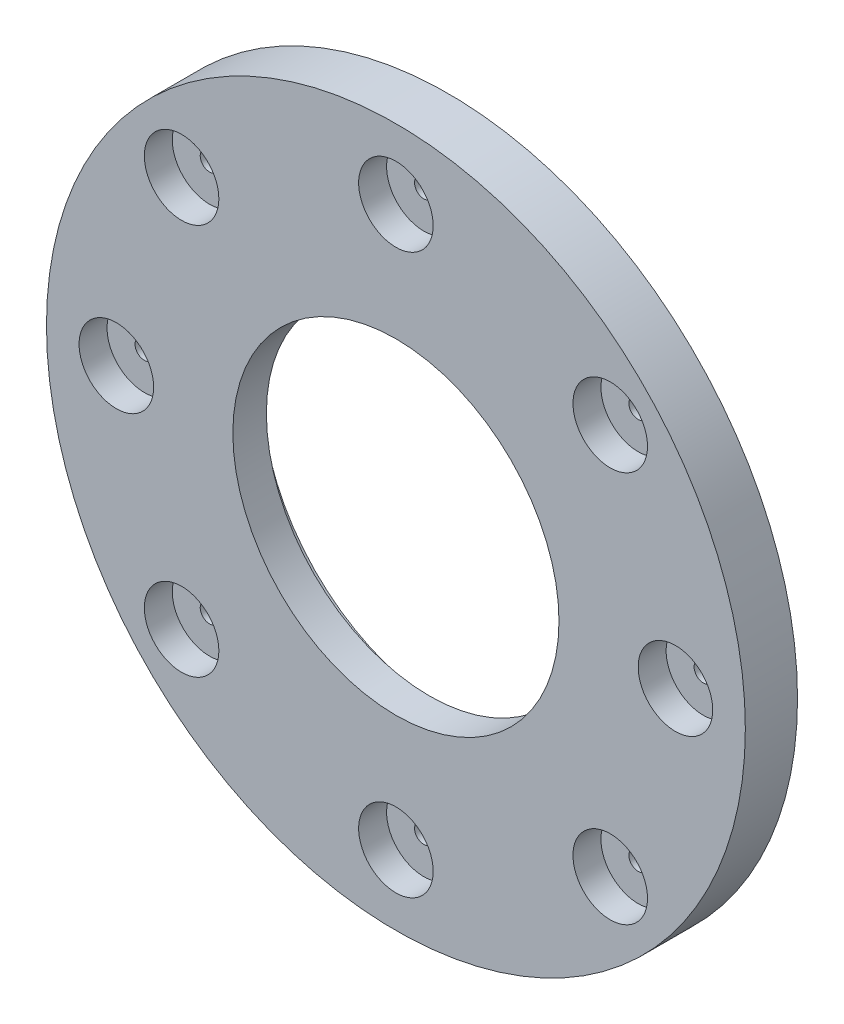
ISO-10303-21;
HEADER;
FILE_DESCRIPTION(('STEP AP214'),'2;1');
FILE_NAME('part.step','',(''),(''),'','','');
FILE_SCHEMA(('AUTOMOTIVE_DESIGN { 1 0 10303 214 1 1 1 1 }'));
ENDSEC;
DATA;
#1=APPLICATION_CONTEXT('core data for automotive mechanical design processes');
#2=APPLICATION_PROTOCOL_DEFINITION('international standard','automotive_design',2000,#1);
#3=PRODUCT_CONTEXT('',#1,'mechanical');
#4=PRODUCT('Part','Part','',(#3));
#5=PRODUCT_RELATED_PRODUCT_CATEGORY('part','',(#4));
#6=PRODUCT_DEFINITION_FORMATION('','',#4);
#7=PRODUCT_DEFINITION_CONTEXT('part definition',#1,'design');
#8=PRODUCT_DEFINITION('design','',#6,#7);
#9=PRODUCT_DEFINITION_SHAPE('','',#8);
#10=(LENGTH_UNIT() NAMED_UNIT(*) SI_UNIT(.MILLI.,.METRE.));
#11=(NAMED_UNIT(*) PLANE_ANGLE_UNIT() SI_UNIT($,.RADIAN.));
#12=(NAMED_UNIT(*) SI_UNIT($,.STERADIAN.) SOLID_ANGLE_UNIT());
#13=UNCERTAINTY_MEASURE_WITH_UNIT(LENGTH_MEASURE(1.E-05),#10,'distance_accuracy_value','');
#14=(GEOMETRIC_REPRESENTATION_CONTEXT(3) GLOBAL_UNCERTAINTY_ASSIGNED_CONTEXT((#13)) GLOBAL_UNIT_ASSIGNED_CONTEXT((#10,
#11,#12)) REPRESENTATION_CONTEXT('',''));
#15=CARTESIAN_POINT('',(0.,0.,0.));
#16=DIRECTION('',(0.,0.,1.));
#17=DIRECTION('',(1.,0.,0.));
#18=AXIS2_PLACEMENT_3D('',#15,#16,#17);
#19=CARTESIAN_POINT('',(0.,0.,2.6));
#20=DIRECTION('',(0.,0.,1.));
#21=DIRECTION('',(1.,0.,0.));
#22=AXIS2_PLACEMENT_3D('',#19,#20,#21);
#23=PLANE('',#22);
#24=CARTESIAN_POINT('',(0.,30.,2.6));
#25=DIRECTION('',(0.,0.,1.));
#26=DIRECTION('',(1.,0.,0.));
#27=AXIS2_PLACEMENT_3D('',#24,#25,#26);
#28=CIRCLE('',#27,1.);
#29=CARTESIAN_POINT('',(1.,30.,2.6));
#30=VERTEX_POINT('',#29);
#31=EDGE_CURVE('E97',#30,#30,#28,.T.);
#32=ORIENTED_EDGE('',*,*,#31,.F.);
#33=EDGE_LOOP('',(#32));
#34=FACE_BOUND('',#33,.T.);
#35=CARTESIAN_POINT('',(0.,30.,2.6));
#36=DIRECTION('',(0.,0.,1.));
#37=DIRECTION('',(1.,0.,0.));
#38=AXIS2_PLACEMENT_3D('',#35,#36,#37);
#39=CIRCLE('',#38,4.);
#40=CARTESIAN_POINT('',(4.,30.,2.6));
#41=VERTEX_POINT('',#40);
#42=EDGE_CURVE('E138',#41,#41,#39,.T.);
#43=ORIENTED_EDGE('',*,*,#42,.T.);
#44=EDGE_LOOP('',(#43));
#45=FACE_BOUND('',#44,.T.);
#46=ADVANCED_FACE('F41',(#34,#45),#23,.T.);
#47=CARTESIAN_POINT('',(0.,-30.,2.6));
#48=DIRECTION('',(0.,0.,1.));
#49=DIRECTION('',(1.,0.,0.));
#50=AXIS2_PLACEMENT_3D('',#47,#48,#49);
#51=CIRCLE('',#50,1.);
#52=CARTESIAN_POINT('',(1.,-30.,2.6));
#53=VERTEX_POINT('',#52);
#54=EDGE_CURVE('E105',#53,#53,#51,.T.);
#55=ORIENTED_EDGE('',*,*,#54,.F.);
#56=EDGE_LOOP('',(#55));
#57=FACE_BOUND('',#56,.T.);
#58=CARTESIAN_POINT('',(0.,-30.,2.6));
#59=DIRECTION('',(0.,0.,1.));
#60=DIRECTION('',(1.,0.,0.));
#61=AXIS2_PLACEMENT_3D('',#58,#59,#60);
#62=CIRCLE('',#61,4.);
#63=CARTESIAN_POINT('',(4.,-30.,2.6));
#64=VERTEX_POINT('',#63);
#65=EDGE_CURVE('E146',#64,#64,#62,.T.);
#66=ORIENTED_EDGE('',*,*,#65,.T.);
#67=EDGE_LOOP('',(#66));
#68=FACE_BOUND('',#67,.T.);
#69=ADVANCED_FACE('F224',(#57,#68),#23,.T.);
#70=CARTESIAN_POINT('',(30.,0.,2.6));
#71=DIRECTION('',(0.,0.,1.));
#72=DIRECTION('',(1.,0.,0.));
#73=AXIS2_PLACEMENT_3D('',#70,#71,#72);
#74=CIRCLE('',#73,0.999999999999998);
#75=CARTESIAN_POINT('',(31.,0.,2.6));
#76=VERTEX_POINT('',#75);
#77=EDGE_CURVE('E109',#76,#76,#74,.T.);
#78=ORIENTED_EDGE('',*,*,#77,.F.);
#79=EDGE_LOOP('',(#78));
#80=FACE_BOUND('',#79,.T.);
#81=CARTESIAN_POINT('',(30.,0.,2.6));
#82=DIRECTION('',(0.,0.,1.));
#83=DIRECTION('',(1.,0.,0.));
#84=AXIS2_PLACEMENT_3D('',#81,#82,#83);
#85=CIRCLE('',#84,4.);
#86=CARTESIAN_POINT('',(34.,0.,2.6));
#87=VERTEX_POINT('',#86);
#88=EDGE_CURVE('E154',#87,#87,#85,.T.);
#89=ORIENTED_EDGE('',*,*,#88,.T.);
#90=EDGE_LOOP('',(#89));
#91=FACE_BOUND('',#90,.T.);
#92=ADVANCED_FACE('F231',(#80,#91),#23,.T.);
#93=CARTESIAN_POINT('',(-30.,0.,2.6));
#94=DIRECTION('',(0.,0.,1.));
#95=DIRECTION('',(1.,0.,0.));
#96=AXIS2_PLACEMENT_3D('',#93,#94,#95);
#97=CIRCLE('',#96,1.);
#98=CARTESIAN_POINT('',(-29.,0.,2.6));
#99=VERTEX_POINT('',#98);
#100=EDGE_CURVE('E101',#99,#99,#97,.T.);
#101=ORIENTED_EDGE('',*,*,#100,.F.);
#102=EDGE_LOOP('',(#101));
#103=FACE_BOUND('',#102,.T.);
#104=CARTESIAN_POINT('',(-30.,0.,2.6));
#105=DIRECTION('',(0.,0.,1.));
#106=DIRECTION('',(1.,0.,0.));
#107=AXIS2_PLACEMENT_3D('',#104,#105,#106);
#108=CIRCLE('',#107,4.);
#109=CARTESIAN_POINT('',(-26.,0.,2.6));
#110=VERTEX_POINT('',#109);
#111=EDGE_CURVE('E162',#110,#110,#108,.T.);
#112=ORIENTED_EDGE('',*,*,#111,.T.);
#113=EDGE_LOOP('',(#112));
#114=FACE_BOUND('',#113,.T.);
#115=ADVANCED_FACE('F297',(#103,#114),#23,.T.);
#116=CARTESIAN_POINT('',(23.,21.,2.6));
#117=DIRECTION('',(0.,0.,1.));
#118=DIRECTION('',(1.,0.,0.));
#119=AXIS2_PLACEMENT_3D('',#116,#117,#118);
#120=CIRCLE('',#119,1.);
#121=CARTESIAN_POINT('',(24.,21.,2.6));
#122=VERTEX_POINT('',#121);
#123=EDGE_CURVE('E117',#122,#122,#120,.T.);
#124=ORIENTED_EDGE('',*,*,#123,.F.);
#125=EDGE_LOOP('',(#124));
#126=FACE_BOUND('',#125,.T.);
#127=CARTESIAN_POINT('',(23.,21.,2.6));
#128=DIRECTION('',(0.,0.,1.));
#129=DIRECTION('',(1.,0.,0.));
#130=AXIS2_PLACEMENT_3D('',#127,#128,#129);
#131=CIRCLE('',#130,4.);
#132=CARTESIAN_POINT('',(27.,21.,2.6));
#133=VERTEX_POINT('',#132);
#134=EDGE_CURVE('E170',#133,#133,#131,.T.);
#135=ORIENTED_EDGE('',*,*,#134,.T.);
#136=EDGE_LOOP('',(#135));
#137=FACE_BOUND('',#136,.T.);
#138=ADVANCED_FACE('F292',(#126,#137),#23,.T.);
#139=CARTESIAN_POINT('',(-23.,21.,2.6));
#140=DIRECTION('',(0.,0.,1.));
#141=DIRECTION('',(1.,0.,0.));
#142=AXIS2_PLACEMENT_3D('',#139,#140,#141);
#143=CIRCLE('',#142,1.);
#144=CARTESIAN_POINT('',(-22.,21.,2.6));
#145=VERTEX_POINT('',#144);
#146=EDGE_CURVE('E113',#145,#145,#143,.T.);
#147=ORIENTED_EDGE('',*,*,#146,.F.);
#148=EDGE_LOOP('',(#147));
#149=FACE_BOUND('',#148,.T.);
#150=CARTESIAN_POINT('',(-23.,21.,2.6));
#151=DIRECTION('',(0.,0.,1.));
#152=DIRECTION('',(1.,0.,0.));
#153=AXIS2_PLACEMENT_3D('',#150,#151,#152);
#154=CIRCLE('',#153,4.);
#155=CARTESIAN_POINT('',(-19.,21.,2.6));
#156=VERTEX_POINT('',#155);
#157=EDGE_CURVE('E178',#156,#156,#154,.T.);
#158=ORIENTED_EDGE('',*,*,#157,.T.);
#159=EDGE_LOOP('',(#158));
#160=FACE_BOUND('',#159,.T.);
#161=ADVANCED_FACE('F245',(#149,#160),#23,.T.);
#162=CARTESIAN_POINT('',(-23.,-21.,2.6));
#163=DIRECTION('',(0.,0.,1.));
#164=DIRECTION('',(1.,0.,0.));
#165=AXIS2_PLACEMENT_3D('',#162,#163,#164);
#166=CIRCLE('',#165,1.);
#167=CARTESIAN_POINT('',(-22.,-21.,2.6));
#168=VERTEX_POINT('',#167);
#169=EDGE_CURVE('E125',#168,#168,#166,.T.);
#170=ORIENTED_EDGE('',*,*,#169,.F.);
#171=EDGE_LOOP('',(#170));
#172=FACE_BOUND('',#171,.T.);
#173=CARTESIAN_POINT('',(-23.,-21.,2.6));
#174=DIRECTION('',(0.,0.,1.));
#175=DIRECTION('',(1.,0.,0.));
#176=AXIS2_PLACEMENT_3D('',#173,#174,#175);
#177=CIRCLE('',#176,4.);
#178=CARTESIAN_POINT('',(-19.,-21.,2.6));
#179=VERTEX_POINT('',#178);
#180=EDGE_CURVE('E186',#179,#179,#177,.T.);
#181=ORIENTED_EDGE('',*,*,#180,.T.);
#182=EDGE_LOOP('',(#181));
#183=FACE_BOUND('',#182,.T.);
#184=ADVANCED_FACE('F238',(#172,#183),#23,.T.);
#185=CARTESIAN_POINT('',(23.,-21.,2.6));
#186=DIRECTION('',(0.,0.,1.));
#187=DIRECTION('',(1.,0.,0.));
#188=AXIS2_PLACEMENT_3D('',#185,#186,#187);
#189=CIRCLE('',#188,1.);
#190=CARTESIAN_POINT('',(24.,-21.,2.6));
#191=VERTEX_POINT('',#190);
#192=EDGE_CURVE('E121',#191,#191,#189,.T.);
#193=ORIENTED_EDGE('',*,*,#192,.F.);
#194=EDGE_LOOP('',(#193));
#195=FACE_BOUND('',#194,.T.);
#196=CARTESIAN_POINT('',(23.,-21.,2.6));
#197=DIRECTION('',(0.,0.,1.));
#198=DIRECTION('',(1.,0.,0.));
#199=AXIS2_PLACEMENT_3D('',#196,#197,#198);
#200=CIRCLE('',#199,4.);
#201=CARTESIAN_POINT('',(27.,-21.,2.6));
#202=VERTEX_POINT('',#201);
#203=EDGE_CURVE('E194',#202,#202,#200,.T.);
#204=ORIENTED_EDGE('',*,*,#203,.T.);
#205=EDGE_LOOP('',(#204));
#206=FACE_BOUND('',#205,.T.);
#207=ADVANCED_FACE('F227',(#195,#206),#23,.T.);
#208=CARTESIAN_POINT('',(0.,0.,0.));
#209=DIRECTION('',(0.,0.,1.));
#210=DIRECTION('',(1.,0.,0.));
#211=AXIS2_PLACEMENT_3D('',#208,#209,#210);
#212=PLANE('',#211);
#213=CARTESIAN_POINT('',(0.,0.,0.));
#214=DIRECTION('',(0.,0.,1.));
#215=DIRECTION('',(1.,0.,0.));
#216=AXIS2_PLACEMENT_3D('',#213,#214,#215);
#217=CIRCLE('',#216,37.5);
#218=CARTESIAN_POINT('',(37.5,0.,0.));
#219=VERTEX_POINT('',#218);
#220=EDGE_CURVE('E10',#219,#219,#217,.T.);
#221=ORIENTED_EDGE('',*,*,#220,.F.);
#222=EDGE_LOOP('',(#221));
#223=FACE_BOUND('',#222,.T.);
#224=CARTESIAN_POINT('',(0.,0.,0.));
#225=DIRECTION('',(0.,0.,1.));
#226=DIRECTION('',(1.,0.,0.));
#227=AXIS2_PLACEMENT_3D('',#224,#225,#226);
#228=CIRCLE('',#227,20.);
#229=CARTESIAN_POINT('',(20.,0.,0.));
#230=VERTEX_POINT('',#229);
#231=EDGE_CURVE('E49',#230,#230,#228,.T.);
#232=ORIENTED_EDGE('',*,*,#231,.T.);
#233=EDGE_LOOP('',(#232));
#234=FACE_BOUND('',#233,.T.);
#235=CARTESIAN_POINT('',(0.,30.,0.));
#236=DIRECTION('',(0.,0.,1.));
#237=DIRECTION('',(1.,0.,0.));
#238=AXIS2_PLACEMENT_3D('',#235,#236,#237);
#239=CIRCLE('',#238,1.);
#240=CARTESIAN_POINT('',(1.,30.,0.));
#241=VERTEX_POINT('',#240);
#242=EDGE_CURVE('E54',#241,#241,#239,.T.);
#243=ORIENTED_EDGE('',*,*,#242,.T.);
#244=EDGE_LOOP('',(#243));
#245=FACE_BOUND('',#244,.T.);
#246=CARTESIAN_POINT('',(0.,-30.,0.));
#247=DIRECTION('',(0.,0.,1.));
#248=DIRECTION('',(1.,0.,0.));
#249=AXIS2_PLACEMENT_3D('',#246,#247,#248);
#250=CIRCLE('',#249,1.);
#251=CARTESIAN_POINT('',(1.,-30.,0.));
#252=VERTEX_POINT('',#251);
#253=EDGE_CURVE('E59',#252,#252,#250,.T.);
#254=ORIENTED_EDGE('',*,*,#253,.T.);
#255=EDGE_LOOP('',(#254));
#256=FACE_BOUND('',#255,.T.);
#257=CARTESIAN_POINT('',(30.,0.,0.));
#258=DIRECTION('',(0.,0.,1.));
#259=DIRECTION('',(1.,0.,0.));
#260=AXIS2_PLACEMENT_3D('',#257,#258,#259);
#261=CIRCLE('',#260,0.999999999999998);
#262=CARTESIAN_POINT('',(31.,0.,0.));
#263=VERTEX_POINT('',#262);
#264=EDGE_CURVE('E71',#263,#263,#261,.T.);
#265=ORIENTED_EDGE('',*,*,#264,.T.);
#266=EDGE_LOOP('',(#265));
#267=FACE_BOUND('',#266,.T.);
#268=CARTESIAN_POINT('',(-30.,0.,0.));
#269=DIRECTION('',(0.,0.,1.));
#270=DIRECTION('',(1.,0.,0.));
#271=AXIS2_PLACEMENT_3D('',#268,#269,#270);
#272=CIRCLE('',#271,1.);
#273=CARTESIAN_POINT('',(-29.,0.,0.));
#274=VERTEX_POINT('',#273);
#275=EDGE_CURVE('E75',#274,#274,#272,.T.);
#276=ORIENTED_EDGE('',*,*,#275,.T.);
#277=EDGE_LOOP('',(#276));
#278=FACE_BOUND('',#277,.T.);
#279=CARTESIAN_POINT('',(23.,21.,0.));
#280=DIRECTION('',(0.,0.,1.));
#281=DIRECTION('',(1.,0.,0.));
#282=AXIS2_PLACEMENT_3D('',#279,#280,#281);
#283=CIRCLE('',#282,1.);
#284=CARTESIAN_POINT('',(24.,21.,0.));
#285=VERTEX_POINT('',#284);
#286=EDGE_CURVE('E79',#285,#285,#283,.T.);
#287=ORIENTED_EDGE('',*,*,#286,.T.);
#288=EDGE_LOOP('',(#287));
#289=FACE_BOUND('',#288,.T.);
#290=CARTESIAN_POINT('',(-23.,21.,0.));
#291=DIRECTION('',(0.,0.,1.));
#292=DIRECTION('',(1.,0.,0.));
#293=AXIS2_PLACEMENT_3D('',#290,#291,#292);
#294=CIRCLE('',#293,1.);
#295=CARTESIAN_POINT('',(-22.,21.,0.));
#296=VERTEX_POINT('',#295);
#297=EDGE_CURVE('E83',#296,#296,#294,.T.);
#298=ORIENTED_EDGE('',*,*,#297,.T.);
#299=EDGE_LOOP('',(#298));
#300=FACE_BOUND('',#299,.T.);
#301=CARTESIAN_POINT('',(-23.,-21.,0.));
#302=DIRECTION('',(0.,0.,1.));
#303=DIRECTION('',(1.,0.,0.));
#304=AXIS2_PLACEMENT_3D('',#301,#302,#303);
#305=CIRCLE('',#304,1.);
#306=CARTESIAN_POINT('',(-22.,-21.,0.));
#307=VERTEX_POINT('',#306);
#308=EDGE_CURVE('E87',#307,#307,#305,.T.);
#309=ORIENTED_EDGE('',*,*,#308,.T.);
#310=EDGE_LOOP('',(#309));
#311=FACE_BOUND('',#310,.T.);
#312=CARTESIAN_POINT('',(23.,-21.,0.));
#313=DIRECTION('',(0.,0.,1.));
#314=DIRECTION('',(1.,0.,0.));
#315=AXIS2_PLACEMENT_3D('',#312,#313,#314);
#316=CIRCLE('',#315,1.);
#317=CARTESIAN_POINT('',(24.,-21.,0.));
#318=VERTEX_POINT('',#317);
#319=EDGE_CURVE('E65',#318,#318,#316,.T.);
#320=ORIENTED_EDGE('',*,*,#319,.T.);
#321=EDGE_LOOP('',(#320));
#322=FACE_BOUND('',#321,.T.);
#323=ADVANCED_FACE('F237',(#223,#234,#245,#256,#267,#278,#289,#300,#311,#322),#212,.F.);
#324=CARTESIAN_POINT('',(0.,0.,2.));
#325=DIRECTION('',(0.,0.,-1.));
#326=DIRECTION('',(-1.,0.,0.));
#327=AXIS2_PLACEMENT_3D('',#324,#325,#326);
#328=CYLINDRICAL_SURFACE('',#327,37.5);
#329=ORIENTED_EDGE('',*,*,#220,.T.);
#330=EDGE_LOOP('',(#329));
#331=FACE_BOUND('',#330,.T.);
#332=CARTESIAN_POINT('',(0.,0.,5.6));
#333=DIRECTION('',(0.,0.,1.));
#334=DIRECTION('',(1.,0.,0.));
#335=AXIS2_PLACEMENT_3D('',#332,#333,#334);
#336=CIRCLE('',#335,37.5);
#337=CARTESIAN_POINT('',(37.5,0.,5.6));
#338=VERTEX_POINT('',#337);
#339=EDGE_CURVE('E129',#338,#338,#336,.T.);
#340=ORIENTED_EDGE('',*,*,#339,.F.);
#341=EDGE_LOOP('',(#340));
#342=FACE_BOUND('',#341,.T.);
#343=ADVANCED_FACE('F43',(#331,#342),#328,.T.);
#344=CARTESIAN_POINT('',(0.,0.,2.));
#345=DIRECTION('',(0.,0.,-1.));
#346=DIRECTION('',(-1.,0.,0.));
#347=AXIS2_PLACEMENT_3D('',#344,#345,#346);
#348=CYLINDRICAL_SURFACE('',#347,20.);
#349=CARTESIAN_POINT('',(0.,0.,2.));
#350=DIRECTION('',(0.,0.,1.));
#351=DIRECTION('',(1.,0.,0.));
#352=AXIS2_PLACEMENT_3D('',#349,#350,#351);
#353=CIRCLE('',#352,20.);
#354=CARTESIAN_POINT('',(20.,0.,2.));
#355=VERTEX_POINT('',#354);
#356=EDGE_CURVE('E62',#355,#355,#353,.T.);
#357=ORIENTED_EDGE('',*,*,#356,.T.);
#358=EDGE_LOOP('',(#357));
#359=FACE_BOUND('',#358,.T.);
#360=ORIENTED_EDGE('',*,*,#231,.F.);
#361=EDGE_LOOP('',(#360));
#362=FACE_BOUND('',#361,.T.);
#363=ADVANCED_FACE('F334',(#359,#362),#348,.F.);
#364=CARTESIAN_POINT('',(0.,30.,2.));
#365=DIRECTION('',(0.,0.,-1.));
#366=DIRECTION('',(-1.,0.,0.));
#367=AXIS2_PLACEMENT_3D('',#364,#365,#366);
#368=CYLINDRICAL_SURFACE('',#367,1.);
#369=ORIENTED_EDGE('',*,*,#242,.F.);
#370=EDGE_LOOP('',(#369));
#371=FACE_BOUND('',#370,.T.);
#372=ORIENTED_EDGE('',*,*,#31,.T.);
#373=EDGE_LOOP('',(#372));
#374=FACE_BOUND('',#373,.T.);
#375=ADVANCED_FACE('F330',(#371,#374),#368,.F.);
#376=CARTESIAN_POINT('',(0.,-30.,2.));
#377=DIRECTION('',(0.,0.,-1.));
#378=DIRECTION('',(-1.,0.,0.));
#379=AXIS2_PLACEMENT_3D('',#376,#377,#378);
#380=CYLINDRICAL_SURFACE('',#379,1.);
#381=ORIENTED_EDGE('',*,*,#253,.F.);
#382=EDGE_LOOP('',(#381));
#383=FACE_BOUND('',#382,.T.);
#384=ORIENTED_EDGE('',*,*,#54,.T.);
#385=EDGE_LOOP('',(#384));
#386=FACE_BOUND('',#385,.T.);
#387=ADVANCED_FACE('F326',(#383,#386),#380,.F.);
#388=CARTESIAN_POINT('',(30.,0.,2.));
#389=DIRECTION('',(0.,0.,-1.));
#390=DIRECTION('',(-1.,0.,0.));
#391=AXIS2_PLACEMENT_3D('',#388,#389,#390);
#392=CYLINDRICAL_SURFACE('',#391,0.999999999999998);
#393=ORIENTED_EDGE('',*,*,#264,.F.);
#394=EDGE_LOOP('',(#393));
#395=FACE_BOUND('',#394,.T.);
#396=ORIENTED_EDGE('',*,*,#77,.T.);
#397=EDGE_LOOP('',(#396));
#398=FACE_BOUND('',#397,.T.);
#399=ADVANCED_FACE('F322',(#395,#398),#392,.F.);
#400=CARTESIAN_POINT('',(-30.,0.,2.));
#401=DIRECTION('',(0.,0.,-1.));
#402=DIRECTION('',(-1.,0.,0.));
#403=AXIS2_PLACEMENT_3D('',#400,#401,#402);
#404=CYLINDRICAL_SURFACE('',#403,1.);
#405=ORIENTED_EDGE('',*,*,#275,.F.);
#406=EDGE_LOOP('',(#405));
#407=FACE_BOUND('',#406,.T.);
#408=ORIENTED_EDGE('',*,*,#100,.T.);
#409=EDGE_LOOP('',(#408));
#410=FACE_BOUND('',#409,.T.);
#411=ADVANCED_FACE('F314',(#407,#410),#404,.F.);
#412=CARTESIAN_POINT('',(23.,21.,2.));
#413=DIRECTION('',(0.,0.,-1.));
#414=DIRECTION('',(-1.,0.,0.));
#415=AXIS2_PLACEMENT_3D('',#412,#413,#414);
#416=CYLINDRICAL_SURFACE('',#415,1.);
#417=ORIENTED_EDGE('',*,*,#286,.F.);
#418=EDGE_LOOP('',(#417));
#419=FACE_BOUND('',#418,.T.);
#420=ORIENTED_EDGE('',*,*,#123,.T.);
#421=EDGE_LOOP('',(#420));
#422=FACE_BOUND('',#421,.T.);
#423=ADVANCED_FACE('F304',(#419,#422),#416,.F.);
#424=CARTESIAN_POINT('',(-23.,21.,2.));
#425=DIRECTION('',(0.,0.,-1.));
#426=DIRECTION('',(-1.,0.,0.));
#427=AXIS2_PLACEMENT_3D('',#424,#425,#426);
#428=CYLINDRICAL_SURFACE('',#427,1.);
#429=ORIENTED_EDGE('',*,*,#297,.F.);
#430=EDGE_LOOP('',(#429));
#431=FACE_BOUND('',#430,.T.);
#432=ORIENTED_EDGE('',*,*,#146,.T.);
#433=EDGE_LOOP('',(#432));
#434=FACE_BOUND('',#433,.T.);
#435=ADVANCED_FACE('F301',(#431,#434),#428,.F.);
#436=CARTESIAN_POINT('',(-23.,-21.,2.));
#437=DIRECTION('',(0.,0.,-1.));
#438=DIRECTION('',(-1.,0.,0.));
#439=AXIS2_PLACEMENT_3D('',#436,#437,#438);
#440=CYLINDRICAL_SURFACE('',#439,1.);
#441=ORIENTED_EDGE('',*,*,#308,.F.);
#442=EDGE_LOOP('',(#441));
#443=FACE_BOUND('',#442,.T.);
#444=ORIENTED_EDGE('',*,*,#169,.T.);
#445=EDGE_LOOP('',(#444));
#446=FACE_BOUND('',#445,.T.);
#447=ADVANCED_FACE('F303',(#443,#446),#440,.F.);
#448=CARTESIAN_POINT('',(23.,-21.,2.));
#449=DIRECTION('',(0.,0.,-1.));
#450=DIRECTION('',(-1.,0.,0.));
#451=AXIS2_PLACEMENT_3D('',#448,#449,#450);
#452=CYLINDRICAL_SURFACE('',#451,1.);
#453=ORIENTED_EDGE('',*,*,#319,.F.);
#454=EDGE_LOOP('',(#453));
#455=FACE_BOUND('',#454,.T.);
#456=ORIENTED_EDGE('',*,*,#192,.T.);
#457=EDGE_LOOP('',(#456));
#458=FACE_BOUND('',#457,.T.);
#459=ADVANCED_FACE('F311',(#455,#458),#452,.F.);
#460=CARTESIAN_POINT('',(0.,0.,2.));
#461=DIRECTION('',(0.,0.,1.));
#462=DIRECTION('',(1.,0.,0.));
#463=AXIS2_PLACEMENT_3D('',#460,#461,#462);
#464=PLANE('',#463);
#465=CARTESIAN_POINT('',(0.,0.,2.));
#466=DIRECTION('',(0.,0.,1.));
#467=DIRECTION('',(1.,0.,0.));
#468=AXIS2_PLACEMENT_3D('',#465,#466,#467);
#469=CIRCLE('',#468,17.5);
#470=CARTESIAN_POINT('',(17.5,0.,2.));
#471=VERTEX_POINT('',#470);
#472=EDGE_CURVE('E66',#471,#471,#469,.T.);
#473=ORIENTED_EDGE('',*,*,#472,.T.);
#474=EDGE_LOOP('',(#473));
#475=FACE_BOUND('',#474,.T.);
#476=ORIENTED_EDGE('',*,*,#356,.F.);
#477=EDGE_LOOP('',(#476));
#478=FACE_BOUND('',#477,.T.);
#479=ADVANCED_FACE('F218',(#475,#478),#464,.F.);
#480=CARTESIAN_POINT('',(0.,0.,2.6));
#481=DIRECTION('',(0.,0.,-1.));
#482=DIRECTION('',(-1.,0.,0.));
#483=AXIS2_PLACEMENT_3D('',#480,#481,#482);
#484=CYLINDRICAL_SURFACE('',#483,17.5);
#485=ORIENTED_EDGE('',*,*,#472,.F.);
#486=EDGE_LOOP('',(#485));
#487=FACE_BOUND('',#486,.T.);
#488=CARTESIAN_POINT('',(0.,0.,5.6));
#489=DIRECTION('',(0.,0.,1.));
#490=DIRECTION('',(1.,0.,0.));
#491=AXIS2_PLACEMENT_3D('',#488,#489,#490);
#492=CIRCLE('',#491,17.5);
#493=CARTESIAN_POINT('',(17.5,0.,5.6));
#494=VERTEX_POINT('',#493);
#495=EDGE_CURVE('E133',#494,#494,#492,.T.);
#496=ORIENTED_EDGE('',*,*,#495,.T.);
#497=EDGE_LOOP('',(#496));
#498=FACE_BOUND('',#497,.T.);
#499=ADVANCED_FACE('F208',(#487,#498),#484,.F.);
#500=CARTESIAN_POINT('',(0.,0.,5.6));
#501=DIRECTION('',(0.,0.,1.));
#502=DIRECTION('',(1.,0.,0.));
#503=AXIS2_PLACEMENT_3D('',#500,#501,#502);
#504=PLANE('',#503);
#505=CARTESIAN_POINT('',(-23.,-21.,5.6));
#506=DIRECTION('',(0.,0.,1.));
#507=DIRECTION('',(1.,0.,0.));
#508=AXIS2_PLACEMENT_3D('',#505,#506,#507);
#509=CIRCLE('',#508,4.);
#510=CARTESIAN_POINT('',(-19.,-21.,5.6));
#511=VERTEX_POINT('',#510);
#512=EDGE_CURVE('E182',#511,#511,#509,.T.);
#513=ORIENTED_EDGE('',*,*,#512,.F.);
#514=EDGE_LOOP('',(#513));
#515=FACE_BOUND('',#514,.T.);
#516=CARTESIAN_POINT('',(23.,21.,5.6));
#517=DIRECTION('',(0.,0.,1.));
#518=DIRECTION('',(1.,0.,0.));
#519=AXIS2_PLACEMENT_3D('',#516,#517,#518);
#520=CIRCLE('',#519,4.);
#521=CARTESIAN_POINT('',(27.,21.,5.6));
#522=VERTEX_POINT('',#521);
#523=EDGE_CURVE('E166',#522,#522,#520,.T.);
#524=ORIENTED_EDGE('',*,*,#523,.F.);
#525=EDGE_LOOP('',(#524));
#526=FACE_BOUND('',#525,.T.);
#527=CARTESIAN_POINT('',(30.,0.,5.6));
#528=DIRECTION('',(0.,0.,1.));
#529=DIRECTION('',(1.,0.,0.));
#530=AXIS2_PLACEMENT_3D('',#527,#528,#529);
#531=CIRCLE('',#530,4.);
#532=CARTESIAN_POINT('',(34.,0.,5.6));
#533=VERTEX_POINT('',#532);
#534=EDGE_CURVE('E150',#533,#533,#531,.T.);
#535=ORIENTED_EDGE('',*,*,#534,.F.);
#536=EDGE_LOOP('',(#535));
#537=FACE_BOUND('',#536,.T.);
#538=CARTESIAN_POINT('',(0.,30.,5.6));
#539=DIRECTION('',(0.,0.,1.));
#540=DIRECTION('',(1.,0.,0.));
#541=AXIS2_PLACEMENT_3D('',#538,#539,#540);
#542=CIRCLE('',#541,4.);
#543=CARTESIAN_POINT('',(4.,30.,5.6));
#544=VERTEX_POINT('',#543);
#545=EDGE_CURVE('E137',#544,#544,#542,.T.);
#546=ORIENTED_EDGE('',*,*,#545,.F.);
#547=EDGE_LOOP('',(#546));
#548=FACE_BOUND('',#547,.T.);
#549=ORIENTED_EDGE('',*,*,#339,.T.);
#550=EDGE_LOOP('',(#549));
#551=FACE_BOUND('',#550,.T.);
#552=ORIENTED_EDGE('',*,*,#495,.F.);
#553=EDGE_LOOP('',(#552));
#554=FACE_BOUND('',#553,.T.);
#555=CARTESIAN_POINT('',(0.,-30.,5.6));
#556=DIRECTION('',(0.,0.,1.));
#557=DIRECTION('',(1.,0.,0.));
#558=AXIS2_PLACEMENT_3D('',#555,#556,#557);
#559=CIRCLE('',#558,4.);
#560=CARTESIAN_POINT('',(4.,-30.,5.6));
#561=VERTEX_POINT('',#560);
#562=EDGE_CURVE('E142',#561,#561,#559,.T.);
#563=ORIENTED_EDGE('',*,*,#562,.F.);
#564=EDGE_LOOP('',(#563));
#565=FACE_BOUND('',#564,.T.);
#566=CARTESIAN_POINT('',(-30.,0.,5.6));
#567=DIRECTION('',(0.,0.,1.));
#568=DIRECTION('',(1.,0.,0.));
#569=AXIS2_PLACEMENT_3D('',#566,#567,#568);
#570=CIRCLE('',#569,4.);
#571=CARTESIAN_POINT('',(-26.,0.,5.6));
#572=VERTEX_POINT('',#571);
#573=EDGE_CURVE('E158',#572,#572,#570,.T.);
#574=ORIENTED_EDGE('',*,*,#573,.F.);
#575=EDGE_LOOP('',(#574));
#576=FACE_BOUND('',#575,.T.);
#577=CARTESIAN_POINT('',(-23.,21.,5.6));
#578=DIRECTION('',(0.,0.,1.));
#579=DIRECTION('',(1.,0.,0.));
#580=AXIS2_PLACEMENT_3D('',#577,#578,#579);
#581=CIRCLE('',#580,4.);
#582=CARTESIAN_POINT('',(-19.,21.,5.6));
#583=VERTEX_POINT('',#582);
#584=EDGE_CURVE('E174',#583,#583,#581,.T.);
#585=ORIENTED_EDGE('',*,*,#584,.F.);
#586=EDGE_LOOP('',(#585));
#587=FACE_BOUND('',#586,.T.);
#588=CARTESIAN_POINT('',(23.,-21.,5.6));
#589=DIRECTION('',(0.,0.,1.));
#590=DIRECTION('',(1.,0.,0.));
#591=AXIS2_PLACEMENT_3D('',#588,#589,#590);
#592=CIRCLE('',#591,4.);
#593=CARTESIAN_POINT('',(27.,-21.,5.6));
#594=VERTEX_POINT('',#593);
#595=EDGE_CURVE('E190',#594,#594,#592,.T.);
#596=ORIENTED_EDGE('',*,*,#595,.F.);
#597=EDGE_LOOP('',(#596));
#598=FACE_BOUND('',#597,.T.);
#599=ADVANCED_FACE('F205',(#515,#526,#537,#548,#551,#554,#565,#576,#587,#598),#504,.T.);
#600=CARTESIAN_POINT('',(0.,30.,5.6));
#601=DIRECTION('',(0.,0.,-1.));
#602=DIRECTION('',(-1.,0.,0.));
#603=AXIS2_PLACEMENT_3D('',#600,#601,#602);
#604=CYLINDRICAL_SURFACE('',#603,4.);
#605=ORIENTED_EDGE('',*,*,#545,.T.);
#606=EDGE_LOOP('',(#605));
#607=FACE_BOUND('',#606,.T.);
#608=ORIENTED_EDGE('',*,*,#42,.F.);
#609=EDGE_LOOP('',(#608));
#610=FACE_BOUND('',#609,.T.);
#611=ADVANCED_FACE('F207',(#607,#610),#604,.F.);
#612=CARTESIAN_POINT('',(0.,-30.,5.6));
#613=DIRECTION('',(0.,0.,-1.));
#614=DIRECTION('',(-1.,0.,0.));
#615=AXIS2_PLACEMENT_3D('',#612,#613,#614);
#616=CYLINDRICAL_SURFACE('',#615,4.);
#617=ORIENTED_EDGE('',*,*,#562,.T.);
#618=EDGE_LOOP('',(#617));
#619=FACE_BOUND('',#618,.T.);
#620=ORIENTED_EDGE('',*,*,#65,.F.);
#621=EDGE_LOOP('',(#620));
#622=FACE_BOUND('',#621,.T.);
#623=ADVANCED_FACE('F215',(#619,#622),#616,.F.);
#624=CARTESIAN_POINT('',(30.,0.,5.6));
#625=DIRECTION('',(0.,0.,-1.));
#626=DIRECTION('',(-1.,0.,0.));
#627=AXIS2_PLACEMENT_3D('',#624,#625,#626);
#628=CYLINDRICAL_SURFACE('',#627,4.);
#629=ORIENTED_EDGE('',*,*,#534,.T.);
#630=EDGE_LOOP('',(#629));
#631=FACE_BOUND('',#630,.T.);
#632=ORIENTED_EDGE('',*,*,#88,.F.);
#633=EDGE_LOOP('',(#632));
#634=FACE_BOUND('',#633,.T.);
#635=ADVANCED_FACE('F270',(#631,#634),#628,.F.);
#636=CARTESIAN_POINT('',(-30.,0.,5.6));
#637=DIRECTION('',(0.,0.,-1.));
#638=DIRECTION('',(-1.,0.,0.));
#639=AXIS2_PLACEMENT_3D('',#636,#637,#638);
#640=CYLINDRICAL_SURFACE('',#639,4.);
#641=ORIENTED_EDGE('',*,*,#573,.T.);
#642=EDGE_LOOP('',(#641));
#643=FACE_BOUND('',#642,.T.);
#644=ORIENTED_EDGE('',*,*,#111,.F.);
#645=EDGE_LOOP('',(#644));
#646=FACE_BOUND('',#645,.T.);
#647=ADVANCED_FACE('F266',(#643,#646),#640,.F.);
#648=CARTESIAN_POINT('',(23.,21.,5.6));
#649=DIRECTION('',(0.,0.,-1.));
#650=DIRECTION('',(-1.,0.,0.));
#651=AXIS2_PLACEMENT_3D('',#648,#649,#650);
#652=CYLINDRICAL_SURFACE('',#651,4.);
#653=ORIENTED_EDGE('',*,*,#523,.T.);
#654=EDGE_LOOP('',(#653));
#655=FACE_BOUND('',#654,.T.);
#656=ORIENTED_EDGE('',*,*,#134,.F.);
#657=EDGE_LOOP('',(#656));
#658=FACE_BOUND('',#657,.T.);
#659=ADVANCED_FACE('F262',(#655,#658),#652,.F.);
#660=CARTESIAN_POINT('',(-23.,21.,5.6));
#661=DIRECTION('',(0.,0.,-1.));
#662=DIRECTION('',(-1.,0.,0.));
#663=AXIS2_PLACEMENT_3D('',#660,#661,#662);
#664=CYLINDRICAL_SURFACE('',#663,4.);
#665=ORIENTED_EDGE('',*,*,#584,.T.);
#666=EDGE_LOOP('',(#665));
#667=FACE_BOUND('',#666,.T.);
#668=ORIENTED_EDGE('',*,*,#157,.F.);
#669=EDGE_LOOP('',(#668));
#670=FACE_BOUND('',#669,.T.);
#671=ADVANCED_FACE('F256',(#667,#670),#664,.F.);
#672=CARTESIAN_POINT('',(-23.,-21.,5.6));
#673=DIRECTION('',(0.,0.,-1.));
#674=DIRECTION('',(-1.,0.,0.));
#675=AXIS2_PLACEMENT_3D('',#672,#673,#674);
#676=CYLINDRICAL_SURFACE('',#675,4.);
#677=ORIENTED_EDGE('',*,*,#512,.T.);
#678=EDGE_LOOP('',(#677));
#679=FACE_BOUND('',#678,.T.);
#680=ORIENTED_EDGE('',*,*,#180,.F.);
#681=EDGE_LOOP('',(#680));
#682=FACE_BOUND('',#681,.T.);
#683=ADVANCED_FACE('F251',(#679,#682),#676,.F.);
#684=CARTESIAN_POINT('',(23.,-21.,5.6));
#685=DIRECTION('',(0.,0.,-1.));
#686=DIRECTION('',(-1.,0.,0.));
#687=AXIS2_PLACEMENT_3D('',#684,#685,#686);
#688=CYLINDRICAL_SURFACE('',#687,4.);
#689=ORIENTED_EDGE('',*,*,#595,.T.);
#690=EDGE_LOOP('',(#689));
#691=FACE_BOUND('',#690,.T.);
#692=ORIENTED_EDGE('',*,*,#203,.F.);
#693=EDGE_LOOP('',(#692));
#694=FACE_BOUND('',#693,.T.);
#695=ADVANCED_FACE('F202',(#691,#694),#688,.F.);
#696=CLOSED_SHELL('',(#46,#69,#92,#115,#138,#161,#184,#207,#323,#343,#363,#375,#387,#399,#411,
#423,#435,#447,#459,#479,#499,#599,#611,#623,#635,#647,#659,#671,#683,#695));
#697=MANIFOLD_SOLID_BREP('B2',#696);
#698=ADVANCED_BREP_SHAPE_REPRESENTATION('',(#18,#697),#14);
#699=SHAPE_DEFINITION_REPRESENTATION(#9,#698);
ENDSEC;
END-ISO-10303-21;
